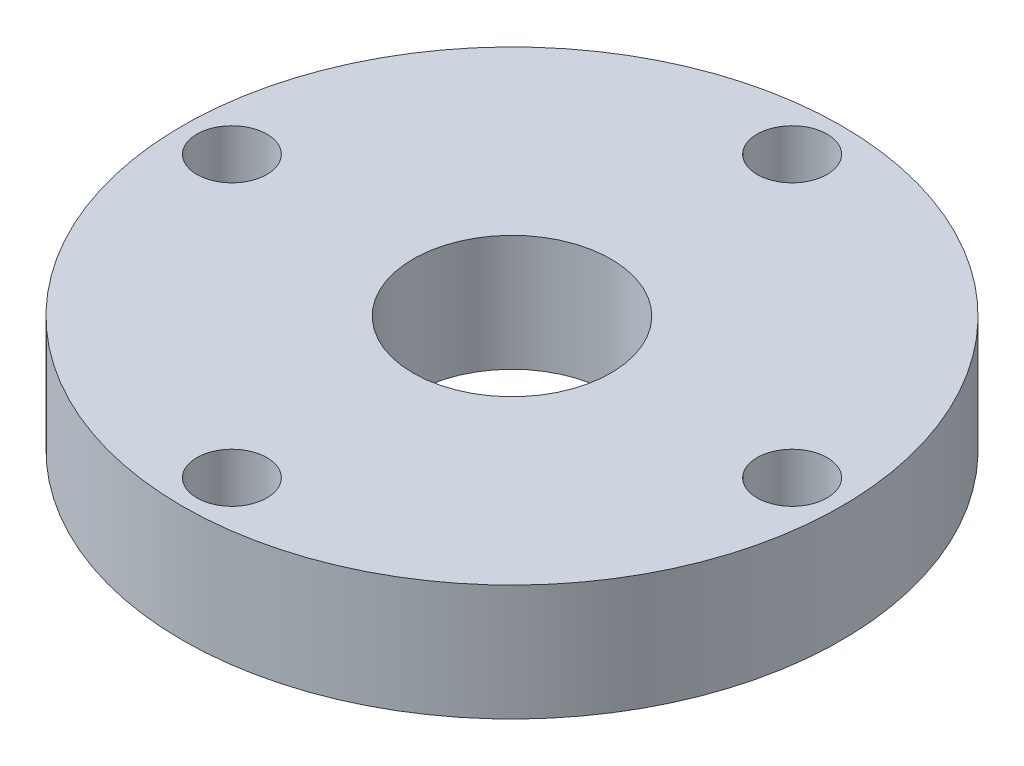
ISO-10303-21;
HEADER;
FILE_DESCRIPTION(('STEP AP214'),'2;1');
FILE_NAME('part.step','',(''),(''),'','','');
FILE_SCHEMA(('AUTOMOTIVE_DESIGN { 1 0 10303 214 1 1 1 1 }'));
ENDSEC;
DATA;
#1=APPLICATION_CONTEXT('core data for automotive mechanical design processes');
#2=APPLICATION_PROTOCOL_DEFINITION('international standard','automotive_design',2000,#1);
#3=PRODUCT_CONTEXT('',#1,'mechanical');
#4=PRODUCT('Part','Part','',(#3));
#5=PRODUCT_RELATED_PRODUCT_CATEGORY('part','',(#4));
#6=PRODUCT_DEFINITION_FORMATION('','',#4);
#7=PRODUCT_DEFINITION_CONTEXT('part definition',#1,'design');
#8=PRODUCT_DEFINITION('design','',#6,#7);
#9=PRODUCT_DEFINITION_SHAPE('','',#8);
#10=(LENGTH_UNIT() NAMED_UNIT(*) SI_UNIT(.MILLI.,.METRE.));
#11=(NAMED_UNIT(*) PLANE_ANGLE_UNIT() SI_UNIT($,.RADIAN.));
#12=(NAMED_UNIT(*) SI_UNIT($,.STERADIAN.) SOLID_ANGLE_UNIT());
#13=UNCERTAINTY_MEASURE_WITH_UNIT(LENGTH_MEASURE(1.E-05),#10,'distance_accuracy_value','');
#14=(GEOMETRIC_REPRESENTATION_CONTEXT(3) GLOBAL_UNCERTAINTY_ASSIGNED_CONTEXT((#13)) GLOBAL_UNIT_ASSIGNED_CONTEXT((#10,
#11,#12)) REPRESENTATION_CONTEXT('',''));
#15=CARTESIAN_POINT('',(0.,0.,0.));
#16=DIRECTION('',(0.,0.,1.));
#17=DIRECTION('',(1.,0.,0.));
#18=AXIS2_PLACEMENT_3D('',#15,#16,#17);
#19=CARTESIAN_POINT('',(0.,-115.824,-53.975));
#20=DIRECTION('',(0.,1.,0.));
#21=DIRECTION('',(0.,0.,1.));
#22=AXIS2_PLACEMENT_3D('',#19,#20,#21);
#23=CYLINDRICAL_SURFACE('',#22,4.3688);
#24=CARTESIAN_POINT('',(0.,-11.176,-53.975));
#25=DIRECTION('',(0.,1.,0.));
#26=DIRECTION('',(0.,0.,1.));
#27=AXIS2_PLACEMENT_3D('',#24,#25,#26);
#28=CIRCLE('',#27,4.3688);
#29=CARTESIAN_POINT('',(0.,-11.176,-49.6062));
#30=VERTEX_POINT('',#29);
#31=EDGE_CURVE('E71',#30,#30,#28,.T.);
#32=ORIENTED_EDGE('',*,*,#31,.F.);
#33=EDGE_LOOP('',(#32));
#34=FACE_BOUND('',#33,.T.);
#35=CARTESIAN_POINT('',(0.,1.524,-53.975));
#36=DIRECTION('',(0.,1.,0.));
#37=DIRECTION('',(0.,0.,1.));
#38=AXIS2_PLACEMENT_3D('',#35,#36,#37);
#39=CIRCLE('',#38,4.3688);
#40=CARTESIAN_POINT('',(0.,1.524,-49.6062));
#41=VERTEX_POINT('',#40);
#42=EDGE_CURVE('E45',#41,#41,#39,.F.);
#43=ORIENTED_EDGE('',*,*,#42,.F.);
#44=EDGE_LOOP('',(#43));
#45=FACE_BOUND('',#44,.T.);
#46=ADVANCED_FACE('F41',(#34,#45),#23,.F.);
#47=CARTESIAN_POINT('',(53.975,-115.824,0.));
#48=DIRECTION('',(0.,1.,0.));
#49=DIRECTION('',(0.,0.,1.));
#50=AXIS2_PLACEMENT_3D('',#47,#48,#49);
#51=CYLINDRICAL_SURFACE('',#50,4.3688);
#52=CARTESIAN_POINT('',(53.975,-11.176,0.));
#53=DIRECTION('',(0.,1.,0.));
#54=DIRECTION('',(0.,0.,1.));
#55=AXIS2_PLACEMENT_3D('',#52,#53,#54);
#56=CIRCLE('',#55,4.3688);
#57=CARTESIAN_POINT('',(53.975,-11.176,4.3688));
#58=VERTEX_POINT('',#57);
#59=EDGE_CURVE('E75',#58,#58,#56,.T.);
#60=ORIENTED_EDGE('',*,*,#59,.F.);
#61=EDGE_LOOP('',(#60));
#62=FACE_BOUND('',#61,.T.);
#63=CARTESIAN_POINT('',(53.975,1.524,0.));
#64=DIRECTION('',(0.,1.,0.));
#65=DIRECTION('',(0.,0.,1.));
#66=AXIS2_PLACEMENT_3D('',#63,#64,#65);
#67=CIRCLE('',#66,4.3688);
#68=CARTESIAN_POINT('',(53.975,1.524,4.3688));
#69=VERTEX_POINT('',#68);
#70=EDGE_CURVE('E65',#69,#69,#67,.F.);
#71=ORIENTED_EDGE('',*,*,#70,.F.);
#72=EDGE_LOOP('',(#71));
#73=FACE_BOUND('',#72,.T.);
#74=ADVANCED_FACE('F118',(#62,#73),#51,.F.);
#75=CARTESIAN_POINT('',(0.,-115.824,53.975));
#76=DIRECTION('',(0.,1.,0.));
#77=DIRECTION('',(0.,0.,1.));
#78=AXIS2_PLACEMENT_3D('',#75,#76,#77);
#79=CYLINDRICAL_SURFACE('',#78,4.3688);
#80=CARTESIAN_POINT('',(0.,-11.176,53.975));
#81=DIRECTION('',(0.,1.,0.));
#82=DIRECTION('',(0.,0.,1.));
#83=AXIS2_PLACEMENT_3D('',#80,#81,#82);
#84=CIRCLE('',#83,4.3688);
#85=CARTESIAN_POINT('',(0.,-11.176,58.3438));
#86=VERTEX_POINT('',#85);
#87=EDGE_CURVE('E80',#86,#86,#84,.T.);
#88=ORIENTED_EDGE('',*,*,#87,.F.);
#89=EDGE_LOOP('',(#88));
#90=FACE_BOUND('',#89,.T.);
#91=CARTESIAN_POINT('',(0.,1.524,53.975));
#92=DIRECTION('',(0.,1.,0.));
#93=DIRECTION('',(0.,0.,1.));
#94=AXIS2_PLACEMENT_3D('',#91,#92,#93);
#95=CIRCLE('',#94,4.3688);
#96=CARTESIAN_POINT('',(0.,1.524,58.3438));
#97=VERTEX_POINT('',#96);
#98=EDGE_CURVE('E63',#97,#97,#95,.F.);
#99=ORIENTED_EDGE('',*,*,#98,.F.);
#100=EDGE_LOOP('',(#99));
#101=FACE_BOUND('',#100,.T.);
#102=ADVANCED_FACE('F114',(#90,#101),#79,.F.);
#103=CARTESIAN_POINT('',(-53.975,-115.824,0.));
#104=DIRECTION('',(0.,1.,0.));
#105=DIRECTION('',(0.,0.,1.));
#106=AXIS2_PLACEMENT_3D('',#103,#104,#105);
#107=CYLINDRICAL_SURFACE('',#106,4.3688);
#108=CARTESIAN_POINT('',(-53.975,-11.176,0.));
#109=DIRECTION('',(0.,1.,0.));
#110=DIRECTION('',(0.,0.,1.));
#111=AXIS2_PLACEMENT_3D('',#108,#109,#110);
#112=CIRCLE('',#111,4.3688);
#113=CARTESIAN_POINT('',(-53.975,-11.176,4.3688));
#114=VERTEX_POINT('',#113);
#115=EDGE_CURVE('E61',#114,#114,#112,.T.);
#116=ORIENTED_EDGE('',*,*,#115,.F.);
#117=EDGE_LOOP('',(#116));
#118=FACE_BOUND('',#117,.T.);
#119=CARTESIAN_POINT('',(-53.975,1.524,0.));
#120=DIRECTION('',(0.,1.,0.));
#121=DIRECTION('',(0.,0.,1.));
#122=AXIS2_PLACEMENT_3D('',#119,#120,#121);
#123=CIRCLE('',#122,4.3688);
#124=CARTESIAN_POINT('',(-53.975,1.524,4.3688));
#125=VERTEX_POINT('',#124);
#126=EDGE_CURVE('E58',#125,#125,#123,.F.);
#127=ORIENTED_EDGE('',*,*,#126,.F.);
#128=EDGE_LOOP('',(#127));
#129=FACE_BOUND('',#128,.T.);
#130=ADVANCED_FACE('F104',(#118,#129),#107,.F.);
#131=CARTESIAN_POINT('',(0.,-11.176,0.));
#132=DIRECTION('',(0.,1.,0.));
#133=DIRECTION('',(0.,0.,1.));
#134=AXIS2_PLACEMENT_3D('',#131,#132,#133);
#135=PLANE('',#134);
#136=ORIENTED_EDGE('',*,*,#87,.T.);
#137=EDGE_LOOP('',(#136));
#138=FACE_BOUND('',#137,.T.);
#139=ORIENTED_EDGE('',*,*,#59,.T.);
#140=EDGE_LOOP('',(#139));
#141=FACE_BOUND('',#140,.T.);
#142=ORIENTED_EDGE('',*,*,#31,.T.);
#143=EDGE_LOOP('',(#142));
#144=FACE_BOUND('',#143,.T.);
#145=ORIENTED_EDGE('',*,*,#115,.T.);
#146=EDGE_LOOP('',(#145));
#147=FACE_BOUND('',#146,.T.);
#148=CARTESIAN_POINT('',(0.,-11.176,0.));
#149=DIRECTION('',(0.,1.,0.));
#150=DIRECTION('',(0.,0.,1.));
#151=AXIS2_PLACEMENT_3D('',#148,#149,#150);
#152=CIRCLE('',#151,19.05);
#153=CARTESIAN_POINT('',(0.,-11.176,19.05));
#154=VERTEX_POINT('',#153);
#155=EDGE_CURVE('E54',#154,#154,#152,.F.);
#156=ORIENTED_EDGE('',*,*,#155,.F.);
#157=EDGE_LOOP('',(#156));
#158=FACE_BOUND('',#157,.T.);
#159=CARTESIAN_POINT('',(0.,-11.176,0.));
#160=DIRECTION('',(0.,-1.,0.));
#161=DIRECTION('',(0.,0.,-1.));
#162=AXIS2_PLACEMENT_3D('',#159,#160,#161);
#163=CIRCLE('',#162,63.5);
#164=CARTESIAN_POINT('',(0.,-11.176,-63.5));
#165=VERTEX_POINT('',#164);
#166=EDGE_CURVE('E10',#165,#165,#163,.T.);
#167=ORIENTED_EDGE('',*,*,#166,.T.);
#168=EDGE_LOOP('',(#167));
#169=FACE_BOUND('',#168,.T.);
#170=ADVANCED_FACE('F43',(#138,#141,#144,#147,#158,#169),#135,.F.);
#171=CARTESIAN_POINT('',(0.,-36.576,0.));
#172=DIRECTION('',(0.,-1.,0.));
#173=DIRECTION('',(0.,0.,-1.));
#174=AXIS2_PLACEMENT_3D('',#171,#172,#173);
#175=CYLINDRICAL_SURFACE('',#174,63.5);
#176=ORIENTED_EDGE('',*,*,#166,.F.);
#177=EDGE_LOOP('',(#176));
#178=FACE_BOUND('',#177,.T.);
#179=CARTESIAN_POINT('',(0.,11.176,0.));
#180=DIRECTION('',(0.,-1.,0.));
#181=DIRECTION('',(0.,0.,-1.));
#182=AXIS2_PLACEMENT_3D('',#179,#180,#181);
#183=CIRCLE('',#182,63.5);
#184=CARTESIAN_POINT('',(0.,11.176,-63.5));
#185=VERTEX_POINT('',#184);
#186=EDGE_CURVE('E49',#185,#185,#183,.T.);
#187=ORIENTED_EDGE('',*,*,#186,.T.);
#188=EDGE_LOOP('',(#187));
#189=FACE_BOUND('',#188,.T.);
#190=ADVANCED_FACE('F103',(#178,#189),#175,.T.);
#191=CARTESIAN_POINT('',(-63.5,11.176,0.));
#192=DIRECTION('',(0.,-1.,0.));
#193=DIRECTION('',(0.,0.,-1.));
#194=AXIS2_PLACEMENT_3D('',#191,#192,#193);
#195=PLANE('',#194);
#196=CARTESIAN_POINT('',(0.,11.176,53.975));
#197=DIRECTION('',(0.,1.,0.));
#198=DIRECTION('',(0.,0.,1.));
#199=AXIS2_PLACEMENT_3D('',#196,#197,#198);
#200=CIRCLE('',#199,6.7437);
#201=CARTESIAN_POINT('',(0.,11.176,60.7187));
#202=VERTEX_POINT('',#201);
#203=EDGE_CURVE('E149',#202,#202,#200,.T.);
#204=ORIENTED_EDGE('',*,*,#203,.F.);
#205=EDGE_LOOP('',(#204));
#206=FACE_BOUND('',#205,.T.);
#207=CARTESIAN_POINT('',(53.975,11.176,0.));
#208=DIRECTION('',(0.,1.,0.));
#209=DIRECTION('',(0.,0.,1.));
#210=AXIS2_PLACEMENT_3D('',#207,#208,#209);
#211=CIRCLE('',#210,6.7437);
#212=CARTESIAN_POINT('',(53.975,11.176,6.7437));
#213=VERTEX_POINT('',#212);
#214=EDGE_CURVE('E153',#213,#213,#211,.T.);
#215=ORIENTED_EDGE('',*,*,#214,.F.);
#216=EDGE_LOOP('',(#215));
#217=FACE_BOUND('',#216,.T.);
#218=CARTESIAN_POINT('',(0.,11.176,-53.975));
#219=DIRECTION('',(0.,1.,0.));
#220=DIRECTION('',(0.,0.,1.));
#221=AXIS2_PLACEMENT_3D('',#218,#219,#220);
#222=CIRCLE('',#221,6.7437);
#223=CARTESIAN_POINT('',(0.,11.176,-47.2313));
#224=VERTEX_POINT('',#223);
#225=EDGE_CURVE('E157',#224,#224,#222,.T.);
#226=ORIENTED_EDGE('',*,*,#225,.F.);
#227=EDGE_LOOP('',(#226));
#228=FACE_BOUND('',#227,.T.);
#229=CARTESIAN_POINT('',(-53.975,11.176,0.));
#230=DIRECTION('',(0.,1.,0.));
#231=DIRECTION('',(0.,0.,1.));
#232=AXIS2_PLACEMENT_3D('',#229,#230,#231);
#233=CIRCLE('',#232,6.7437);
#234=CARTESIAN_POINT('',(-53.975,11.176,6.7437));
#235=VERTEX_POINT('',#234);
#236=EDGE_CURVE('E88',#235,#235,#233,.T.);
#237=ORIENTED_EDGE('',*,*,#236,.F.);
#238=EDGE_LOOP('',(#237));
#239=FACE_BOUND('',#238,.T.);
#240=CARTESIAN_POINT('',(0.,11.176,0.));
#241=DIRECTION('',(0.,1.,0.));
#242=DIRECTION('',(0.,0.,1.));
#243=AXIS2_PLACEMENT_3D('',#240,#241,#242);
#244=CIRCLE('',#243,19.05);
#245=CARTESIAN_POINT('',(0.,11.176,19.05));
#246=VERTEX_POINT('',#245);
#247=EDGE_CURVE('E95',#246,#246,#244,.T.);
#248=ORIENTED_EDGE('',*,*,#247,.F.);
#249=EDGE_LOOP('',(#248));
#250=FACE_BOUND('',#249,.T.);
#251=ORIENTED_EDGE('',*,*,#186,.F.);
#252=EDGE_LOOP('',(#251));
#253=FACE_BOUND('',#252,.T.);
#254=ADVANCED_FACE('F111',(#206,#217,#228,#239,#250,#253),#195,.F.);
#255=CARTESIAN_POINT('',(0.,-11.177,0.));
#256=DIRECTION('',(0.,1.,0.));
#257=DIRECTION('',(0.,0.,1.));
#258=AXIS2_PLACEMENT_3D('',#255,#256,#257);
#259=CYLINDRICAL_SURFACE('',#258,19.05);
#260=ORIENTED_EDGE('',*,*,#247,.T.);
#261=EDGE_LOOP('',(#260));
#262=FACE_BOUND('',#261,.T.);
#263=ORIENTED_EDGE('',*,*,#155,.T.);
#264=EDGE_LOOP('',(#263));
#265=FACE_BOUND('',#264,.T.);
#266=ADVANCED_FACE('F100',(#262,#265),#259,.F.);
#267=CARTESIAN_POINT('',(-53.975,1.524,0.));
#268=DIRECTION('',(0.,1.,0.));
#269=DIRECTION('',(0.,0.,1.));
#270=AXIS2_PLACEMENT_3D('',#267,#268,#269);
#271=PLANE('',#270);
#272=CARTESIAN_POINT('',(-53.975,1.524,0.));
#273=DIRECTION('',(0.,1.,0.));
#274=DIRECTION('',(0.,0.,1.));
#275=AXIS2_PLACEMENT_3D('',#272,#273,#274);
#276=CIRCLE('',#275,6.7437);
#277=CARTESIAN_POINT('',(-53.975,1.524,6.7437));
#278=VERTEX_POINT('',#277);
#279=EDGE_CURVE('E62',#278,#278,#276,.T.);
#280=ORIENTED_EDGE('',*,*,#279,.T.);
#281=EDGE_LOOP('',(#280));
#282=FACE_BOUND('',#281,.T.);
#283=ORIENTED_EDGE('',*,*,#126,.T.);
#284=EDGE_LOOP('',(#283));
#285=FACE_BOUND('',#284,.T.);
#286=ADVANCED_FACE('F129',(#282,#285),#271,.T.);
#287=CARTESIAN_POINT('',(-53.975,1.524,0.));
#288=DIRECTION('',(0.,1.,0.));
#289=DIRECTION('',(0.,0.,1.));
#290=AXIS2_PLACEMENT_3D('',#287,#288,#289);
#291=CYLINDRICAL_SURFACE('',#290,6.7437);
#292=ORIENTED_EDGE('',*,*,#279,.F.);
#293=EDGE_LOOP('',(#292));
#294=FACE_BOUND('',#293,.T.);
#295=ORIENTED_EDGE('',*,*,#236,.T.);
#296=EDGE_LOOP('',(#295));
#297=FACE_BOUND('',#296,.T.);
#298=ADVANCED_FACE('F132',(#294,#297),#291,.F.);
#299=CARTESIAN_POINT('',(0.,1.524,53.975));
#300=DIRECTION('',(0.,1.,0.));
#301=DIRECTION('',(0.,0.,1.));
#302=AXIS2_PLACEMENT_3D('',#299,#300,#301);
#303=PLANE('',#302);
#304=CARTESIAN_POINT('',(0.,1.524,53.975));
#305=DIRECTION('',(0.,1.,0.));
#306=DIRECTION('',(0.,0.,1.));
#307=AXIS2_PLACEMENT_3D('',#304,#305,#306);
#308=CIRCLE('',#307,6.7437);
#309=CARTESIAN_POINT('',(0.,1.524,60.7187));
#310=VERTEX_POINT('',#309);
#311=EDGE_CURVE('E66',#310,#310,#308,.T.);
#312=ORIENTED_EDGE('',*,*,#311,.T.);
#313=EDGE_LOOP('',(#312));
#314=FACE_BOUND('',#313,.T.);
#315=ORIENTED_EDGE('',*,*,#98,.T.);
#316=EDGE_LOOP('',(#315));
#317=FACE_BOUND('',#316,.T.);
#318=ADVANCED_FACE('F134',(#314,#317),#303,.T.);
#319=CARTESIAN_POINT('',(0.,1.524,53.975));
#320=DIRECTION('',(0.,1.,0.));
#321=DIRECTION('',(0.,0.,1.));
#322=AXIS2_PLACEMENT_3D('',#319,#320,#321);
#323=CYLINDRICAL_SURFACE('',#322,6.7437);
#324=ORIENTED_EDGE('',*,*,#311,.F.);
#325=EDGE_LOOP('',(#324));
#326=FACE_BOUND('',#325,.T.);
#327=ORIENTED_EDGE('',*,*,#203,.T.);
#328=EDGE_LOOP('',(#327));
#329=FACE_BOUND('',#328,.T.);
#330=ADVANCED_FACE('F178',(#326,#329),#323,.F.);
#331=CARTESIAN_POINT('',(53.975,1.524,0.));
#332=DIRECTION('',(0.,1.,0.));
#333=DIRECTION('',(0.,0.,1.));
#334=AXIS2_PLACEMENT_3D('',#331,#332,#333);
#335=PLANE('',#334);
#336=CARTESIAN_POINT('',(53.975,1.524,0.));
#337=DIRECTION('',(0.,1.,0.));
#338=DIRECTION('',(0.,0.,1.));
#339=AXIS2_PLACEMENT_3D('',#336,#337,#338);
#340=CIRCLE('',#339,6.7437);
#341=CARTESIAN_POINT('',(53.975,1.524,6.7437));
#342=VERTEX_POINT('',#341);
#343=EDGE_CURVE('E166',#342,#342,#340,.T.);
#344=ORIENTED_EDGE('',*,*,#343,.T.);
#345=EDGE_LOOP('',(#344));
#346=FACE_BOUND('',#345,.T.);
#347=ORIENTED_EDGE('',*,*,#70,.T.);
#348=EDGE_LOOP('',(#347));
#349=FACE_BOUND('',#348,.T.);
#350=ADVANCED_FACE('F181',(#346,#349),#335,.T.);
#351=CARTESIAN_POINT('',(53.975,1.524,0.));
#352=DIRECTION('',(0.,1.,0.));
#353=DIRECTION('',(0.,0.,1.));
#354=AXIS2_PLACEMENT_3D('',#351,#352,#353);
#355=CYLINDRICAL_SURFACE('',#354,6.7437);
#356=ORIENTED_EDGE('',*,*,#343,.F.);
#357=EDGE_LOOP('',(#356));
#358=FACE_BOUND('',#357,.T.);
#359=ORIENTED_EDGE('',*,*,#214,.T.);
#360=EDGE_LOOP('',(#359));
#361=FACE_BOUND('',#360,.T.);
#362=ADVANCED_FACE('F186',(#358,#361),#355,.F.);
#363=CARTESIAN_POINT('',(0.,1.524,-53.975));
#364=DIRECTION('',(0.,1.,0.));
#365=DIRECTION('',(0.,0.,1.));
#366=AXIS2_PLACEMENT_3D('',#363,#364,#365);
#367=PLANE('',#366);
#368=CARTESIAN_POINT('',(0.,1.524,-53.975));
#369=DIRECTION('',(0.,1.,0.));
#370=DIRECTION('',(0.,0.,1.));
#371=AXIS2_PLACEMENT_3D('',#368,#369,#370);
#372=CIRCLE('',#371,6.7437);
#373=CARTESIAN_POINT('',(0.,1.524,-47.2313));
#374=VERTEX_POINT('',#373);
#375=EDGE_CURVE('E83',#374,#374,#372,.T.);
#376=ORIENTED_EDGE('',*,*,#375,.T.);
#377=EDGE_LOOP('',(#376));
#378=FACE_BOUND('',#377,.T.);
#379=ORIENTED_EDGE('',*,*,#42,.T.);
#380=EDGE_LOOP('',(#379));
#381=FACE_BOUND('',#380,.T.);
#382=ADVANCED_FACE('F192',(#378,#381),#367,.T.);
#383=CARTESIAN_POINT('',(0.,1.524,-53.975));
#384=DIRECTION('',(0.,1.,0.));
#385=DIRECTION('',(0.,0.,1.));
#386=AXIS2_PLACEMENT_3D('',#383,#384,#385);
#387=CYLINDRICAL_SURFACE('',#386,6.7437);
#388=ORIENTED_EDGE('',*,*,#375,.F.);
#389=EDGE_LOOP('',(#388));
#390=FACE_BOUND('',#389,.T.);
#391=ORIENTED_EDGE('',*,*,#225,.T.);
#392=EDGE_LOOP('',(#391));
#393=FACE_BOUND('',#392,.T.);
#394=ADVANCED_FACE('F195',(#390,#393),#387,.F.);
#395=CLOSED_SHELL('',(#46,#74,#102,#130,#170,#190,#254,#266,#286,#298,#318,#330,#350,#362,#382,#394));
#396=MANIFOLD_SOLID_BREP('B2',#395);
#397=ADVANCED_BREP_SHAPE_REPRESENTATION('',(#18,#396),#14);
#398=SHAPE_DEFINITION_REPRESENTATION(#9,#397);
ENDSEC;
END-ISO-10303-21;
